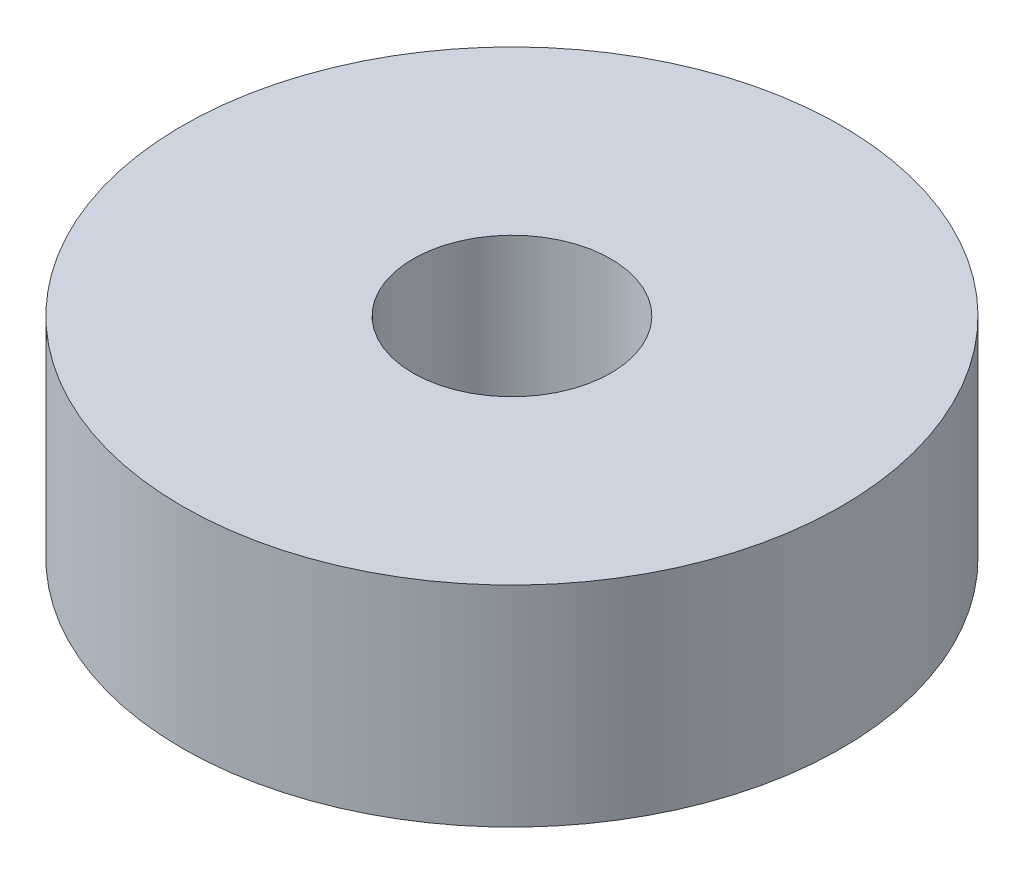
ISO-10303-21;
HEADER;
FILE_DESCRIPTION(('STEP AP214'),'2;1');
FILE_NAME('part.step','',(''),(''),'','','');
FILE_SCHEMA(('AUTOMOTIVE_DESIGN { 1 0 10303 214 1 1 1 1 }'));
ENDSEC;
DATA;
#1=APPLICATION_CONTEXT('core data for automotive mechanical design processes');
#2=APPLICATION_PROTOCOL_DEFINITION('international standard','automotive_design',2000,#1);
#3=PRODUCT_CONTEXT('',#1,'mechanical');
#4=PRODUCT('Part','Part','',(#3));
#5=PRODUCT_RELATED_PRODUCT_CATEGORY('part','',(#4));
#6=PRODUCT_DEFINITION_FORMATION('','',#4);
#7=PRODUCT_DEFINITION_CONTEXT('part definition',#1,'design');
#8=PRODUCT_DEFINITION('design','',#6,#7);
#9=PRODUCT_DEFINITION_SHAPE('','',#8);
#10=(LENGTH_UNIT() NAMED_UNIT(*) SI_UNIT(.MILLI.,.METRE.));
#11=(NAMED_UNIT(*) PLANE_ANGLE_UNIT() SI_UNIT($,.RADIAN.));
#12=(NAMED_UNIT(*) SI_UNIT($,.STERADIAN.) SOLID_ANGLE_UNIT());
#13=UNCERTAINTY_MEASURE_WITH_UNIT(LENGTH_MEASURE(1.E-05),#10,'distance_accuracy_value','');
#14=(GEOMETRIC_REPRESENTATION_CONTEXT(3) GLOBAL_UNCERTAINTY_ASSIGNED_CONTEXT((#13)) GLOBAL_UNIT_ASSIGNED_CONTEXT((#10,
#11,#12)) REPRESENTATION_CONTEXT('',''));
#15=CARTESIAN_POINT('',(0.,0.,0.));
#16=DIRECTION('',(0.,0.,1.));
#17=DIRECTION('',(1.,0.,0.));
#18=AXIS2_PLACEMENT_3D('',#15,#16,#17);
#19=CARTESIAN_POINT('',(1.68370415584828,3.175,-0.967834465551231));
#20=DIRECTION('',(0.,1.,0.));
#21=DIRECTION('',(0.,0.,1.));
#22=AXIS2_PLACEMENT_3D('',#19,#20,#21);
#23=PLANE('',#22);
#24=CARTESIAN_POINT('',(1.68370415584828,3.175,-0.967834465551231));
#25=DIRECTION('',(0.,1.,0.));
#26=DIRECTION('',(0.,0.,1.));
#27=AXIS2_PLACEMENT_3D('',#24,#25,#26);
#28=CIRCLE('',#27,4.9911);
#29=CARTESIAN_POINT('',(1.68370415584828,3.175,4.02326553444877));
#30=VERTEX_POINT('',#29);
#31=EDGE_CURVE('E10',#30,#30,#28,.T.);
#32=ORIENTED_EDGE('',*,*,#31,.T.);
#33=EDGE_LOOP('',(#32));
#34=FACE_BOUND('',#33,.T.);
#35=CARTESIAN_POINT('',(1.68370415584828,3.175,-0.967834465551231));
#36=DIRECTION('',(0.,1.,0.));
#37=DIRECTION('',(0.,0.,1.));
#38=AXIS2_PLACEMENT_3D('',#35,#36,#37);
#39=CIRCLE('',#38,1.4986);
#40=CARTESIAN_POINT('',(1.68370415584828,3.175,0.530765534448769));
#41=VERTEX_POINT('',#40);
#42=EDGE_CURVE('E42',#41,#41,#39,.T.);
#43=ORIENTED_EDGE('',*,*,#42,.F.);
#44=EDGE_LOOP('',(#43));
#45=FACE_BOUND('',#44,.T.);
#46=ADVANCED_FACE('F31',(#34,#45),#23,.T.);
#47=CARTESIAN_POINT('',(1.68370415584828,0.,-0.967834465551231));
#48=DIRECTION('',(0.,1.,0.));
#49=DIRECTION('',(0.,0.,1.));
#50=AXIS2_PLACEMENT_3D('',#47,#48,#49);
#51=PLANE('',#50);
#52=CARTESIAN_POINT('',(1.68370415584828,0.,-0.967834465551231));
#53=DIRECTION('',(0.,1.,0.));
#54=DIRECTION('',(0.,0.,1.));
#55=AXIS2_PLACEMENT_3D('',#52,#53,#54);
#56=CIRCLE('',#55,4.9911);
#57=CARTESIAN_POINT('',(1.68370415584828,0.,4.02326553444877));
#58=VERTEX_POINT('',#57);
#59=EDGE_CURVE('E35',#58,#58,#56,.T.);
#60=ORIENTED_EDGE('',*,*,#59,.F.);
#61=EDGE_LOOP('',(#60));
#62=FACE_BOUND('',#61,.T.);
#63=CARTESIAN_POINT('',(1.68370415584828,0.,-0.967834465551231));
#64=DIRECTION('',(0.,1.,0.));
#65=DIRECTION('',(0.,0.,1.));
#66=AXIS2_PLACEMENT_3D('',#63,#64,#65);
#67=CIRCLE('',#66,1.4986);
#68=CARTESIAN_POINT('',(1.68370415584828,0.,0.530765534448769));
#69=VERTEX_POINT('',#68);
#70=EDGE_CURVE('E44',#69,#69,#67,.T.);
#71=ORIENTED_EDGE('',*,*,#70,.T.);
#72=EDGE_LOOP('',(#71));
#73=FACE_BOUND('',#72,.T.);
#74=ADVANCED_FACE('F54',(#62,#73),#51,.F.);
#75=CARTESIAN_POINT('',(1.68370415584828,3.175,-0.967834465551231));
#76=DIRECTION('',(0.,-1.,0.));
#77=DIRECTION('',(0.,0.,-1.));
#78=AXIS2_PLACEMENT_3D('',#75,#76,#77);
#79=CYLINDRICAL_SURFACE('',#78,4.9911);
#80=ORIENTED_EDGE('',*,*,#31,.F.);
#81=EDGE_LOOP('',(#80));
#82=FACE_BOUND('',#81,.T.);
#83=ORIENTED_EDGE('',*,*,#59,.T.);
#84=EDGE_LOOP('',(#83));
#85=FACE_BOUND('',#84,.T.);
#86=ADVANCED_FACE('F33',(#82,#85),#79,.T.);
#87=CARTESIAN_POINT('',(1.68370415584828,3.175,-0.967834465551231));
#88=DIRECTION('',(0.,-1.,0.));
#89=DIRECTION('',(0.,0.,-1.));
#90=AXIS2_PLACEMENT_3D('',#87,#88,#89);
#91=CYLINDRICAL_SURFACE('',#90,1.4986);
#92=ORIENTED_EDGE('',*,*,#42,.T.);
#93=EDGE_LOOP('',(#92));
#94=FACE_BOUND('',#93,.T.);
#95=ORIENTED_EDGE('',*,*,#70,.F.);
#96=EDGE_LOOP('',(#95));
#97=FACE_BOUND('',#96,.T.);
#98=ADVANCED_FACE('F50',(#94,#97),#91,.F.);
#99=CLOSED_SHELL('',(#46,#74,#86,#98));
#100=MANIFOLD_SOLID_BREP('B2',#99);
#101=ADVANCED_BREP_SHAPE_REPRESENTATION('',(#18,#100),#14);
#102=SHAPE_DEFINITION_REPRESENTATION(#9,#101);
ENDSEC;
END-ISO-10303-21;
